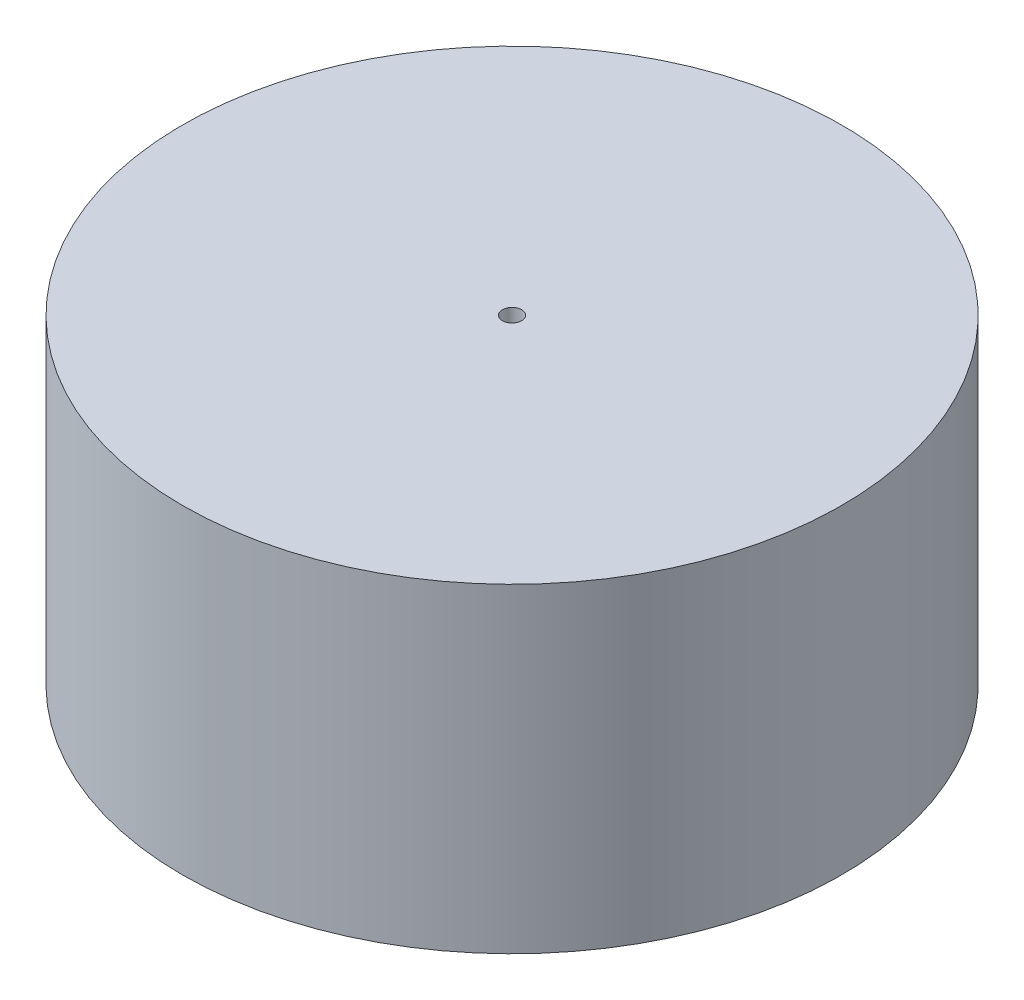
ISO-10303-21;
HEADER;
FILE_DESCRIPTION(('STEP AP214'),'2;1');
FILE_NAME('part.step','',(''),(''),'','','');
FILE_SCHEMA(('AUTOMOTIVE_DESIGN { 1 0 10303 214 1 1 1 1 }'));
ENDSEC;
DATA;
#1=APPLICATION_CONTEXT('core data for automotive mechanical design processes');
#2=APPLICATION_PROTOCOL_DEFINITION('international standard','automotive_design',2000,#1);
#3=PRODUCT_CONTEXT('',#1,'mechanical');
#4=PRODUCT('Part','Part','',(#3));
#5=PRODUCT_RELATED_PRODUCT_CATEGORY('part','',(#4));
#6=PRODUCT_DEFINITION_FORMATION('','',#4);
#7=PRODUCT_DEFINITION_CONTEXT('part definition',#1,'design');
#8=PRODUCT_DEFINITION('design','',#6,#7);
#9=PRODUCT_DEFINITION_SHAPE('','',#8);
#10=(LENGTH_UNIT() NAMED_UNIT(*) SI_UNIT(.MILLI.,.METRE.));
#11=(NAMED_UNIT(*) PLANE_ANGLE_UNIT() SI_UNIT($,.RADIAN.));
#12=(NAMED_UNIT(*) SI_UNIT($,.STERADIAN.) SOLID_ANGLE_UNIT());
#13=UNCERTAINTY_MEASURE_WITH_UNIT(LENGTH_MEASURE(1.E-05),#10,'distance_accuracy_value','');
#14=(GEOMETRIC_REPRESENTATION_CONTEXT(3) GLOBAL_UNCERTAINTY_ASSIGNED_CONTEXT((#13)) GLOBAL_UNIT_ASSIGNED_CONTEXT((#10,
#11,#12)) REPRESENTATION_CONTEXT('',''));
#15=CARTESIAN_POINT('',(0.,0.,0.));
#16=DIRECTION('',(0.,0.,1.));
#17=DIRECTION('',(1.,0.,0.));
#18=AXIS2_PLACEMENT_3D('',#15,#16,#17);
#19=CARTESIAN_POINT('',(0.,7.2360070467492,0.));
#20=DIRECTION('',(0.,-1.,0.));
#21=DIRECTION('',(0.,0.,-1.));
#22=AXIS2_PLACEMENT_3D('',#19,#20,#21);
#23=CONICAL_SURFACE('',#22,4.77813150291565,0.154510034947646);
#24=CARTESIAN_POINT('',(0.,10.9696876670045,0.));
#25=DIRECTION('',(0.,1.,0.));
#26=DIRECTION('',(0.,0.,1.));
#27=AXIS2_PLACEMENT_3D('',#24,#25,#26);
#28=CIRCLE('',#27,4.1966053384343);
#29=CARTESIAN_POINT('',(0.,10.9696876670045,4.1966053384343));
#30=VERTEX_POINT('',#29);
#31=EDGE_CURVE('E10',#30,#30,#28,.T.);
#32=ORIENTED_EDGE('',*,*,#31,.F.);
#33=EDGE_LOOP('',(#32));
#34=FACE_BOUND('',#33,.T.);
#35=CARTESIAN_POINT('',(0.,7.2360070467492,0.));
#36=DIRECTION('',(0.,1.,0.));
#37=DIRECTION('',(0.,0.,1.));
#38=AXIS2_PLACEMENT_3D('',#35,#36,#37);
#39=CIRCLE('',#38,4.77813150291565);
#40=CARTESIAN_POINT('',(0.,7.2360070467492,4.77813150291565));
#41=VERTEX_POINT('',#40);
#42=EDGE_CURVE('E106',#41,#41,#39,.T.);
#43=ORIENTED_EDGE('',*,*,#42,.T.);
#44=EDGE_LOOP('',(#43));
#45=FACE_BOUND('',#44,.T.);
#46=ADVANCED_FACE('F39',(#34,#45),#23,.T.);
#47=CARTESIAN_POINT('',(4.1966053384343,10.9696876670045,0.));
#48=CARTESIAN_POINT('',(3.92250238613658,11.4418481488206,0.));
#49=CARTESIAN_POINT('',(2.50903523163493,10.9907943919951,0.));
#50=CARTESIAN_POINT('',(2.2205093476461,9.33036497214367,0.));
#51=CARTESIAN_POINT('',(2.32901868984361,8.43087659400773,0.));
#52=B_SPLINE_CURVE_WITH_KNOTS('',3,(#47,#48,#49,#50,#51),.UNSPECIFIED.,.F.,.F.,(4,1,4),(0.,
0.262564072006502,1.),.UNSPECIFIED.);
#53=CARTESIAN_POINT('',(0.,28.780364689577,0.));
#54=DIRECTION('',(0.,1.,0.));
#55=AXIS1_PLACEMENT('',#53,#54);
#56=SURFACE_OF_REVOLUTION('',#52,#55);
#57=CARTESIAN_POINT('',(0.,8.43087659400773,0.));
#58=DIRECTION('',(0.,1.,0.));
#59=DIRECTION('',(0.,0.,1.));
#60=AXIS2_PLACEMENT_3D('',#57,#58,#59);
#61=CIRCLE('',#60,2.32901868984361);
#62=CARTESIAN_POINT('',(0.,8.43087659400773,2.32901868984361));
#63=VERTEX_POINT('',#62);
#64=EDGE_CURVE('E45',#63,#63,#61,.T.);
#65=ORIENTED_EDGE('',*,*,#64,.F.);
#66=EDGE_LOOP('',(#65));
#67=FACE_BOUND('',#66,.T.);
#68=ORIENTED_EDGE('',*,*,#31,.T.);
#69=EDGE_LOOP('',(#68));
#70=FACE_BOUND('',#69,.T.);
#71=ADVANCED_FACE('F161',(#67,#70),#56,.T.);
#72=CARTESIAN_POINT('',(0.,28.780364689577,0.));
#73=DIRECTION('',(0.,1.,0.));
#74=DIRECTION('',(0.,0.,1.));
#75=AXIS2_PLACEMENT_3D('',#72,#73,#74);
#76=CYLINDRICAL_SURFACE('',#75,2.32901868984361);
#77=ORIENTED_EDGE('',*,*,#64,.T.);
#78=EDGE_LOOP('',(#77));
#79=FACE_BOUND('',#78,.T.);
#80=CARTESIAN_POINT('',(0.,3.90305340551168,0.));
#81=DIRECTION('',(0.,1.,0.));
#82=DIRECTION('',(0.,0.,1.));
#83=AXIS2_PLACEMENT_3D('',#80,#81,#82);
#84=CIRCLE('',#83,2.32901868984361);
#85=CARTESIAN_POINT('',(0.,3.90305340551168,2.32901868984361));
#86=VERTEX_POINT('',#85);
#87=EDGE_CURVE('E49',#86,#86,#84,.T.);
#88=ORIENTED_EDGE('',*,*,#87,.F.);
#89=EDGE_LOOP('',(#88));
#90=FACE_BOUND('',#89,.T.);
#91=ADVANCED_FACE('F158',(#79,#90),#76,.F.);
#92=CARTESIAN_POINT('',(0.,1.20668061187904,0.));
#93=DIRECTION('',(0.,-1.,0.));
#94=DIRECTION('',(0.,0.,-1.));
#95=AXIS2_PLACEMENT_3D('',#92,#93,#94);
#96=CONICAL_SURFACE('',#95,2.35,0.0077811520562476);
#97=ORIENTED_EDGE('',*,*,#87,.T.);
#98=EDGE_LOOP('',(#97));
#99=FACE_BOUND('',#98,.T.);
#100=CARTESIAN_POINT('',(0.,1.20668061187904,0.));
#101=DIRECTION('',(0.,1.,0.));
#102=DIRECTION('',(0.,0.,1.));
#103=AXIS2_PLACEMENT_3D('',#100,#101,#102);
#104=CIRCLE('',#103,2.35);
#105=CARTESIAN_POINT('',(0.,1.20668061187904,2.35));
#106=VERTEX_POINT('',#105);
#107=EDGE_CURVE('E53',#106,#106,#104,.T.);
#108=ORIENTED_EDGE('',*,*,#107,.F.);
#109=EDGE_LOOP('',(#108));
#110=FACE_BOUND('',#109,.T.);
#111=ADVANCED_FACE('F154',(#99,#110),#96,.F.);
#112=CARTESIAN_POINT('',(0.,28.780364689577,0.));
#113=DIRECTION('',(0.,1.,0.));
#114=DIRECTION('',(0.,0.,1.));
#115=AXIS2_PLACEMENT_3D('',#112,#113,#114);
#116=CYLINDRICAL_SURFACE('',#115,2.35);
#117=ORIENTED_EDGE('',*,*,#107,.T.);
#118=EDGE_LOOP('',(#117));
#119=FACE_BOUND('',#118,.T.);
#120=CARTESIAN_POINT('',(0.,0.423325242339054,0.));
#121=DIRECTION('',(0.,1.,0.));
#122=DIRECTION('',(0.,0.,1.));
#123=AXIS2_PLACEMENT_3D('',#120,#121,#122);
#124=CIRCLE('',#123,2.35);
#125=CARTESIAN_POINT('',(0.,0.423325242339054,2.35));
#126=VERTEX_POINT('',#125);
#127=EDGE_CURVE('E58',#126,#126,#124,.T.);
#128=ORIENTED_EDGE('',*,*,#127,.F.);
#129=EDGE_LOOP('',(#128));
#130=FACE_BOUND('',#129,.T.);
#131=ADVANCED_FACE('F150',(#119,#130),#116,.F.);
#132=CARTESIAN_POINT('',(0.,0.423325242339054,0.));
#133=DIRECTION('',(0.,-1.,0.));
#134=DIRECTION('',(0.,0.,-1.));
#135=AXIS2_PLACEMENT_3D('',#132,#133,#134);
#136=PLANE('',#135);
#137=ORIENTED_EDGE('',*,*,#127,.T.);
#138=EDGE_LOOP('',(#137));
#139=FACE_BOUND('',#138,.T.);
#140=CARTESIAN_POINT('',(0.,0.423325242339054,0.));
#141=DIRECTION('',(0.,1.,0.));
#142=DIRECTION('',(0.,0.,1.));
#143=AXIS2_PLACEMENT_3D('',#140,#141,#142);
#144=CIRCLE('',#143,15.45);
#145=CARTESIAN_POINT('',(0.,0.423325242339054,15.45));
#146=VERTEX_POINT('',#145);
#147=EDGE_CURVE('E61',#146,#146,#144,.T.);
#148=ORIENTED_EDGE('',*,*,#147,.F.);
#149=EDGE_LOOP('',(#148));
#150=FACE_BOUND('',#149,.T.);
#151=ADVANCED_FACE('F146',(#139,#150),#136,.T.);
#152=CARTESIAN_POINT('',(0.,28.780364689577,0.));
#153=DIRECTION('',(0.,1.,0.));
#154=DIRECTION('',(0.,0.,1.));
#155=AXIS2_PLACEMENT_3D('',#152,#153,#154);
#156=CYLINDRICAL_SURFACE('',#155,15.45);
#157=ORIENTED_EDGE('',*,*,#147,.T.);
#158=EDGE_LOOP('',(#157));
#159=FACE_BOUND('',#158,.T.);
#160=CARTESIAN_POINT('',(0.,15.4233252423391,0.));
#161=DIRECTION('',(0.,1.,0.));
#162=DIRECTION('',(0.,0.,1.));
#163=AXIS2_PLACEMENT_3D('',#160,#161,#162);
#164=CIRCLE('',#163,15.45);
#165=CARTESIAN_POINT('',(0.,15.4233252423391,15.45));
#166=VERTEX_POINT('',#165);
#167=EDGE_CURVE('E64',#166,#166,#164,.T.);
#168=ORIENTED_EDGE('',*,*,#167,.F.);
#169=EDGE_LOOP('',(#168));
#170=FACE_BOUND('',#169,.T.);
#171=ADVANCED_FACE('F142',(#159,#170),#156,.T.);
#172=CARTESIAN_POINT('',(0.,15.4233252423391,0.));
#173=DIRECTION('',(0.,1.,0.));
#174=DIRECTION('',(0.,0.,1.));
#175=AXIS2_PLACEMENT_3D('',#172,#173,#174);
#176=PLANE('',#175);
#177=ORIENTED_EDGE('',*,*,#167,.T.);
#178=EDGE_LOOP('',(#177));
#179=FACE_BOUND('',#178,.T.);
#180=CARTESIAN_POINT('',(0.,15.4233252423391,0.));
#181=DIRECTION('',(0.,1.,0.));
#182=DIRECTION('',(0.,0.,1.));
#183=AXIS2_PLACEMENT_3D('',#180,#181,#182);
#184=CIRCLE('',#183,0.45);
#185=CARTESIAN_POINT('',(0.,15.4233252423391,0.45));
#186=VERTEX_POINT('',#185);
#187=EDGE_CURVE('E67',#186,#186,#184,.T.);
#188=ORIENTED_EDGE('',*,*,#187,.F.);
#189=EDGE_LOOP('',(#188));
#190=FACE_BOUND('',#189,.T.);
#191=ADVANCED_FACE('F138',(#179,#190),#176,.T.);
#192=CARTESIAN_POINT('',(0.,28.780364689577,0.));
#193=DIRECTION('',(0.,1.,0.));
#194=DIRECTION('',(0.,0.,1.));
#195=AXIS2_PLACEMENT_3D('',#192,#193,#194);
#196=CYLINDRICAL_SURFACE('',#195,0.45);
#197=ORIENTED_EDGE('',*,*,#187,.T.);
#198=EDGE_LOOP('',(#197));
#199=FACE_BOUND('',#198,.T.);
#200=CARTESIAN_POINT('',(0.,0.423325242339054,0.));
#201=DIRECTION('',(0.,1.,0.));
#202=DIRECTION('',(0.,0.,1.));
#203=AXIS2_PLACEMENT_3D('',#200,#201,#202);
#204=CIRCLE('',#203,0.45);
#205=CARTESIAN_POINT('',(0.,0.423325242339054,0.45));
#206=VERTEX_POINT('',#205);
#207=EDGE_CURVE('E70',#206,#206,#204,.T.);
#208=ORIENTED_EDGE('',*,*,#207,.F.);
#209=EDGE_LOOP('',(#208));
#210=FACE_BOUND('',#209,.T.);
#211=ADVANCED_FACE('F134',(#199,#210),#196,.F.);
#212=CARTESIAN_POINT('',(0.,0.423325242339054,0.));
#213=DIRECTION('',(0.,-1.,0.));
#214=DIRECTION('',(0.,0.,-1.));
#215=AXIS2_PLACEMENT_3D('',#212,#213,#214);
#216=PLANE('',#215);
#217=ORIENTED_EDGE('',*,*,#207,.T.);
#218=EDGE_LOOP('',(#217));
#219=FACE_BOUND('',#218,.T.);
#220=CARTESIAN_POINT('',(0.,0.423325242339054,0.));
#221=DIRECTION('',(0.,1.,0.));
#222=DIRECTION('',(0.,0.,1.));
#223=AXIS2_PLACEMENT_3D('',#220,#221,#222);
#224=CIRCLE('',#223,0.9);
#225=CARTESIAN_POINT('',(0.,0.423325242339054,0.9));
#226=VERTEX_POINT('',#225);
#227=EDGE_CURVE('E73',#226,#226,#224,.T.);
#228=ORIENTED_EDGE('',*,*,#227,.F.);
#229=EDGE_LOOP('',(#228));
#230=FACE_BOUND('',#229,.T.);
#231=ADVANCED_FACE('F130',(#219,#230),#216,.T.);
#232=CARTESIAN_POINT('',(0.,28.780364689577,0.));
#233=DIRECTION('',(0.,1.,0.));
#234=DIRECTION('',(0.,0.,1.));
#235=AXIS2_PLACEMENT_3D('',#232,#233,#234);
#236=CYLINDRICAL_SURFACE('',#235,0.9);
#237=CARTESIAN_POINT('',(0.,11.2778738285968,0.));
#238=DIRECTION('',(0.,1.,0.));
#239=DIRECTION('',(0.,0.,1.));
#240=AXIS2_PLACEMENT_3D('',#237,#238,#239);
#241=CIRCLE('',#240,0.9);
#242=CARTESIAN_POINT('',(0.,11.2778738285968,0.9));
#243=VERTEX_POINT('',#242);
#244=EDGE_CURVE('E76',#243,#243,#241,.T.);
#245=ORIENTED_EDGE('',*,*,#244,.F.);
#246=EDGE_LOOP('',(#245));
#247=FACE_BOUND('',#246,.T.);
#248=ORIENTED_EDGE('',*,*,#227,.T.);
#249=EDGE_LOOP('',(#248));
#250=FACE_BOUND('',#249,.T.);
#251=ADVANCED_FACE('F125',(#247,#250),#236,.T.);
#252=CARTESIAN_POINT('',(0.9,11.2778738285968,0.));
#253=CARTESIAN_POINT('',(1.15426174938573,13.7967495851767,0.));
#254=CARTESIAN_POINT('',(3.4127411654196,15.0629872275201,0.));
#255=CARTESIAN_POINT('',(6.39488375269739,13.6646495518766,0.));
#256=CARTESIAN_POINT('',(6.37902900244718,12.1274497940698,0.));
#257=CARTESIAN_POINT('',(6.77672225358765,10.540030851107,0.));
#258=CARTESIAN_POINT('',(6.74201352982107,9.22156167415712,0.));
#259=CARTESIAN_POINT('',(7.8257298306234,9.03999219503802,0.));
#260=B_SPLINE_CURVE_WITH_KNOTS('',3,(#252,#253,#254,#255,#256,#257,#258,#259),.UNSPECIFIED.,.F.,
.F.,(4,1,1,1,1,4),(0.,0.440870588449233,0.577759512502071,0.72485152056035,0.783369033629409,
1.),.UNSPECIFIED.);
#261=CARTESIAN_POINT('',(0.,28.780364689577,0.));
#262=DIRECTION('',(0.,1.,0.));
#263=AXIS1_PLACEMENT('',#261,#262);
#264=SURFACE_OF_REVOLUTION('',#260,#263);
#265=CARTESIAN_POINT('',(0.,9.03999219503802,0.));
#266=DIRECTION('',(0.,1.,0.));
#267=DIRECTION('',(0.,0.,1.));
#268=AXIS2_PLACEMENT_3D('',#265,#266,#267);
#269=CIRCLE('',#268,7.8257298306234);
#270=CARTESIAN_POINT('',(0.,9.03999219503802,7.8257298306234));
#271=VERTEX_POINT('',#270);
#272=EDGE_CURVE('E79',#271,#271,#269,.T.);
#273=ORIENTED_EDGE('',*,*,#272,.F.);
#274=EDGE_LOOP('',(#273));
#275=FACE_BOUND('',#274,.T.);
#276=ORIENTED_EDGE('',*,*,#244,.T.);
#277=EDGE_LOOP('',(#276));
#278=FACE_BOUND('',#277,.T.);
#279=ADVANCED_FACE('F120',(#275,#278),#264,.T.);
#280=CARTESIAN_POINT('',(0.,9.03999219503802,0.));
#281=DIRECTION('',(0.,1.,0.));
#282=DIRECTION('',(0.,0.,1.));
#283=AXIS2_PLACEMENT_3D('',#280,#281,#282);
#284=PLANE('',#283);
#285=CARTESIAN_POINT('',(0.,9.03999219503802,0.));
#286=DIRECTION('',(0.,1.,0.));
#287=DIRECTION('',(0.,0.,1.));
#288=AXIS2_PLACEMENT_3D('',#285,#286,#287);
#289=CIRCLE('',#288,14.4932926486767);
#290=CARTESIAN_POINT('',(0.,9.03999219503802,14.4932926486767));
#291=VERTEX_POINT('',#290);
#292=EDGE_CURVE('E82',#291,#291,#289,.T.);
#293=ORIENTED_EDGE('',*,*,#292,.F.);
#294=EDGE_LOOP('',(#293));
#295=FACE_BOUND('',#294,.T.);
#296=ORIENTED_EDGE('',*,*,#272,.T.);
#297=EDGE_LOOP('',(#296));
#298=FACE_BOUND('',#297,.T.);
#299=ADVANCED_FACE('F124',(#295,#298),#284,.F.);
#300=CARTESIAN_POINT('',(0.,28.780364689577,0.));
#301=DIRECTION('',(0.,1.,0.));
#302=DIRECTION('',(0.,0.,1.));
#303=AXIS2_PLACEMENT_3D('',#300,#301,#302);
#304=CYLINDRICAL_SURFACE('',#303,14.4932926486767);
#305=CARTESIAN_POINT('',(0.,4.97734244900619,0.));
#306=DIRECTION('',(0.,1.,0.));
#307=DIRECTION('',(0.,0.,1.));
#308=AXIS2_PLACEMENT_3D('',#305,#306,#307);
#309=CIRCLE('',#308,14.4932926486767);
#310=CARTESIAN_POINT('',(0.,4.97734244900619,14.4932926486767));
#311=VERTEX_POINT('',#310);
#312=EDGE_CURVE('E85',#311,#311,#309,.T.);
#313=ORIENTED_EDGE('',*,*,#312,.F.);
#314=EDGE_LOOP('',(#313));
#315=FACE_BOUND('',#314,.T.);
#316=ORIENTED_EDGE('',*,*,#292,.T.);
#317=EDGE_LOOP('',(#316));
#318=FACE_BOUND('',#317,.T.);
#319=ADVANCED_FACE('F206',(#315,#318),#304,.F.);
#320=CARTESIAN_POINT('',(0.,4.97734244900619,0.));
#321=DIRECTION('',(0.,1.,0.));
#322=DIRECTION('',(0.,0.,1.));
#323=AXIS2_PLACEMENT_3D('',#320,#321,#322);
#324=TOROIDAL_SURFACE('',#323,12.3932926486767,2.1);
#325=CARTESIAN_POINT('',(0.,3.40747974358489,0.));
#326=DIRECTION('',(0.,1.,0.));
#327=DIRECTION('',(0.,0.,1.));
#328=AXIS2_PLACEMENT_3D('',#325,#326,#327);
#329=CIRCLE('',#328,13.7881156073805);
#330=CARTESIAN_POINT('',(0.,3.40747974358489,13.7881156073805));
#331=VERTEX_POINT('',#330);
#332=EDGE_CURVE('E88',#331,#331,#329,.T.);
#333=ORIENTED_EDGE('',*,*,#332,.F.);
#334=EDGE_LOOP('',(#333));
#335=FACE_BOUND('',#334,.T.);
#336=ORIENTED_EDGE('',*,*,#312,.T.);
#337=EDGE_LOOP('',(#336));
#338=FACE_BOUND('',#337,.T.);
#339=ADVANCED_FACE('F203',(#335,#338),#324,.F.);
#340=CARTESIAN_POINT('',(0.,3.40747974358489,0.));
#341=DIRECTION('',(0.,1.,0.));
#342=DIRECTION('',(0.,0.,1.));
#343=AXIS2_PLACEMENT_3D('',#340,#341,#342);
#344=CONICAL_SURFACE('',#343,13.7881156073805,0.844371289048425);
#345=CARTESIAN_POINT('',(0.,3.35810552584885,0.));
#346=DIRECTION('',(0.,1.,0.));
#347=DIRECTION('',(0.,0.,1.));
#348=AXIS2_PLACEMENT_3D('',#345,#346,#347);
#349=CIRCLE('',#348,13.7325452982244);
#350=CARTESIAN_POINT('',(0.,3.35810552584885,13.7325452982244));
#351=VERTEX_POINT('',#350);
#352=EDGE_CURVE('E91',#351,#351,#349,.T.);
#353=ORIENTED_EDGE('',*,*,#352,.F.);
#354=EDGE_LOOP('',(#353));
#355=FACE_BOUND('',#354,.T.);
#356=ORIENTED_EDGE('',*,*,#332,.T.);
#357=EDGE_LOOP('',(#356));
#358=FACE_BOUND('',#357,.T.);
#359=ADVANCED_FACE('F199',(#355,#358),#344,.F.);
#360=CARTESIAN_POINT('',(0.,3.73935789716557,0.));
#361=DIRECTION('',(0.,1.,0.));
#362=DIRECTION('',(0.,0.,1.));
#363=AXIS2_PLACEMENT_3D('',#360,#361,#362);
#364=TOROIDAL_SURFACE('',#363,13.3938025796822,0.51);
#365=ORIENTED_EDGE('',*,*,#352,.T.);
#366=EDGE_LOOP('',(#365));
#367=FACE_BOUND('',#366,.T.);
#368=CARTESIAN_POINT('',(0.,3.23843708100811,0.));
#369=DIRECTION('',(0.,1.,0.));
#370=DIRECTION('',(0.,0.,1.));
#371=AXIS2_PLACEMENT_3D('',#368,#369,#370);
#372=CIRCLE('',#371,13.4896062118688);
#373=CARTESIAN_POINT('',(0.,3.23843708100811,13.4896062118688));
#374=VERTEX_POINT('',#373);
#375=EDGE_CURVE('E94',#374,#374,#372,.T.);
#376=ORIENTED_EDGE('',*,*,#375,.F.);
#377=EDGE_LOOP('',(#376));
#378=FACE_BOUND('',#377,.T.);
#379=ADVANCED_FACE('F193',(#367,#378),#364,.F.);
#380=CARTESIAN_POINT('',(0.,3.23843708100811,0.));
#381=DIRECTION('',(0.,1.,0.));
#382=DIRECTION('',(0.,0.,1.));
#383=AXIS2_PLACEMENT_3D('',#380,#381,#382);
#384=CONICAL_SURFACE('',#383,13.4896062118688,1.38182334513892);
#385=CARTESIAN_POINT('',(0.,3.01896738414949,0.));
#386=DIRECTION('',(0.,1.,0.));
#387=DIRECTION('',(0.,0.,1.));
#388=AXIS2_PLACEMENT_3D('',#385,#386,#387);
#389=CIRCLE('',#388,12.3420824994261);
#390=CARTESIAN_POINT('',(0.,3.01896738414949,12.3420824994261));
#391=VERTEX_POINT('',#390);
#392=EDGE_CURVE('E97',#391,#391,#389,.T.);
#393=ORIENTED_EDGE('',*,*,#392,.F.);
#394=EDGE_LOOP('',(#393));
#395=FACE_BOUND('',#394,.T.);
#396=ORIENTED_EDGE('',*,*,#375,.T.);
#397=EDGE_LOOP('',(#396));
#398=FACE_BOUND('',#397,.T.);
#399=ADVANCED_FACE('F187',(#395,#398),#384,.F.);
#400=CARTESIAN_POINT('',(0.,8.43087659400716,0.));
#401=DIRECTION('',(0.,1.,0.));
#402=DIRECTION('',(0.,0.,1.));
#403=AXIS2_PLACEMENT_3D('',#400,#401,#402);
#404=TOROIDAL_SURFACE('',#403,11.3070275712927,5.5099999999998);
#405=ORIENTED_EDGE('',*,*,#392,.T.);
#406=EDGE_LOOP('',(#405));
#407=FACE_BOUND('',#406,.T.);
#408=CARTESIAN_POINT('',(0.,2.92087659400716,0.));
#409=DIRECTION('',(0.,1.,0.));
#410=DIRECTION('',(0.,0.,1.));
#411=AXIS2_PLACEMENT_3D('',#408,#409,#410);
#412=CIRCLE('',#411,11.3070275712927);
#413=CARTESIAN_POINT('',(0.,2.92087659400716,11.3070275712927));
#414=VERTEX_POINT('',#413);
#415=EDGE_CURVE('E100',#414,#414,#412,.T.);
#416=ORIENTED_EDGE('',*,*,#415,.F.);
#417=EDGE_LOOP('',(#416));
#418=FACE_BOUND('',#417,.T.);
#419=ADVANCED_FACE('F182',(#407,#418),#404,.F.);
#420=CARTESIAN_POINT('',(5.54429354637119E-13,2.9208765940073,0.));
#421=DIRECTION('',(0.,-1.,0.));
#422=DIRECTION('',(0.,0.,-1.));
#423=AXIS2_PLACEMENT_3D('',#420,#421,#422);
#424=PLANE('',#423);
#425=CARTESIAN_POINT('',(0.,2.92087659400744,0.));
#426=DIRECTION('',(0.,1.,0.));
#427=DIRECTION('',(0.,0.,1.));
#428=AXIS2_PLACEMENT_3D('',#425,#426,#427);
#429=CIRCLE('',#428,9.81737547337263);
#430=CARTESIAN_POINT('',(0.,2.92087659400744,9.81737547337263));
#431=VERTEX_POINT('',#430);
#432=EDGE_CURVE('E103',#431,#431,#429,.T.);
#433=ORIENTED_EDGE('',*,*,#432,.F.);
#434=EDGE_LOOP('',(#433));
#435=FACE_BOUND('',#434,.T.);
#436=ORIENTED_EDGE('',*,*,#415,.T.);
#437=EDGE_LOOP('',(#436));
#438=FACE_BOUND('',#437,.T.);
#439=ADVANCED_FACE('F176',(#435,#438),#424,.F.);
#440=CARTESIAN_POINT('',(0.,8.02087659400744,0.));
#441=DIRECTION('',(0.,1.,0.));
#442=DIRECTION('',(0.,0.,1.));
#443=AXIS2_PLACEMENT_3D('',#440,#441,#442);
#444=TOROIDAL_SURFACE('',#443,9.81737547337263,5.10000000000002);
#445=ORIENTED_EDGE('',*,*,#42,.F.);
#446=EDGE_LOOP('',(#445));
#447=FACE_BOUND('',#446,.T.);
#448=ORIENTED_EDGE('',*,*,#432,.T.);
#449=EDGE_LOOP('',(#448));
#450=FACE_BOUND('',#449,.T.);
#451=ADVANCED_FACE('F173',(#447,#450),#444,.F.);
#452=CLOSED_SHELL('',(#46,#71,#91,#111,#131,#151,#171,#191,#211,#231,#251,#279,#299,#319,#339,
#359,#379,#399,#419,#439,#451));
#453=MANIFOLD_SOLID_BREP('B2',#452);
#454=ADVANCED_BREP_SHAPE_REPRESENTATION('',(#18,#453),#14);
#455=SHAPE_DEFINITION_REPRESENTATION(#9,#454);
ENDSEC;
END-ISO-10303-21;
